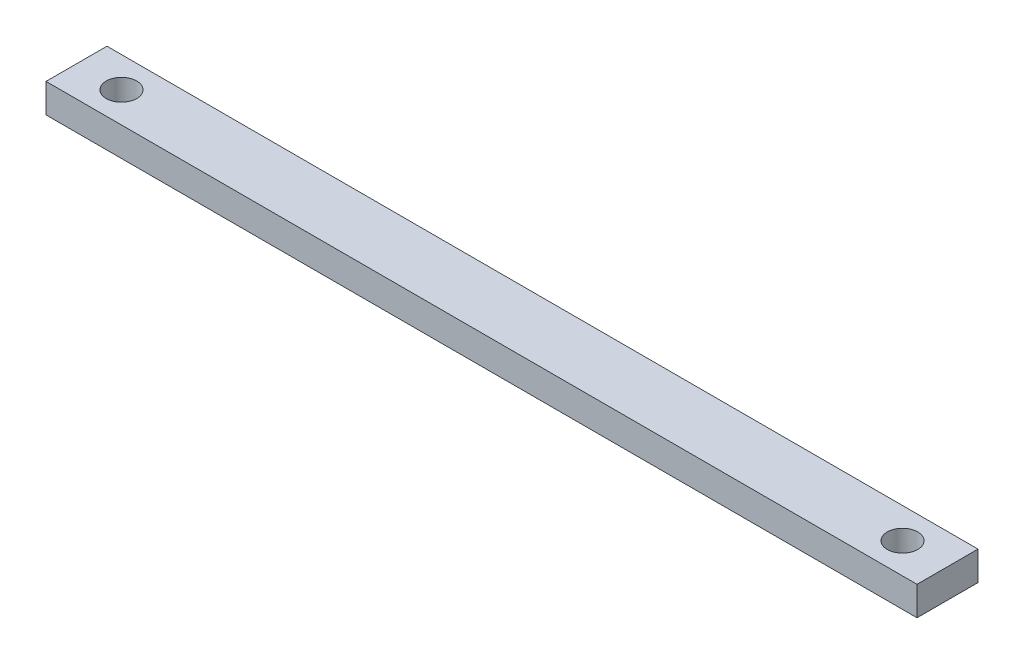
ISO-10303-21;
HEADER;
FILE_DESCRIPTION(('STEP AP214'),'2;1');
FILE_NAME('part.step','',(''),(''),'','','');
FILE_SCHEMA(('AUTOMOTIVE_DESIGN { 1 0 10303 214 1 1 1 1 }'));
ENDSEC;
DATA;
#1=APPLICATION_CONTEXT('core data for automotive mechanical design processes');
#2=APPLICATION_PROTOCOL_DEFINITION('international standard','automotive_design',2000,#1);
#3=PRODUCT_CONTEXT('',#1,'mechanical');
#4=PRODUCT('Part','Part','',(#3));
#5=PRODUCT_RELATED_PRODUCT_CATEGORY('part','',(#4));
#6=PRODUCT_DEFINITION_FORMATION('','',#4);
#7=PRODUCT_DEFINITION_CONTEXT('part definition',#1,'design');
#8=PRODUCT_DEFINITION('design','',#6,#7);
#9=PRODUCT_DEFINITION_SHAPE('','',#8);
#10=(LENGTH_UNIT() NAMED_UNIT(*) SI_UNIT(.MILLI.,.METRE.));
#11=(NAMED_UNIT(*) PLANE_ANGLE_UNIT() SI_UNIT($,.RADIAN.));
#12=(NAMED_UNIT(*) SI_UNIT($,.STERADIAN.) SOLID_ANGLE_UNIT());
#13=UNCERTAINTY_MEASURE_WITH_UNIT(LENGTH_MEASURE(1.E-05),#10,'distance_accuracy_value','');
#14=(GEOMETRIC_REPRESENTATION_CONTEXT(3) GLOBAL_UNCERTAINTY_ASSIGNED_CONTEXT((#13)) GLOBAL_UNIT_ASSIGNED_CONTEXT((#10,
#11,#12)) REPRESENTATION_CONTEXT('',''));
#15=CARTESIAN_POINT('',(0.,0.,0.));
#16=DIRECTION('',(0.,0.,1.));
#17=DIRECTION('',(1.,0.,0.));
#18=AXIS2_PLACEMENT_3D('',#15,#16,#17);
#19=CARTESIAN_POINT('',(300.,20.,21.));
#20=DIRECTION('',(-1.,0.,0.));
#21=DIRECTION('',(0.,0.,1.));
#22=AXIS2_PLACEMENT_3D('',#19,#20,#21);
#23=PLANE('',#22);
#24=DIRECTION('',(0.,0.,-1.));
#25=VECTOR('',#24,1.);
#26=CARTESIAN_POINT('',(300.,0.,21.));
#27=LINE('',#26,#25);
#28=CARTESIAN_POINT('',(300.,0.,21.));
#29=VERTEX_POINT('',#28);
#30=CARTESIAN_POINT('',(300.,0.,-21.));
#31=VERTEX_POINT('',#30);
#32=EDGE_CURVE('E100',#29,#31,#27,.T.);
#33=ORIENTED_EDGE('',*,*,#32,.T.);
#34=DIRECTION('',(0.,-1.,0.));
#35=VECTOR('',#34,1.);
#36=CARTESIAN_POINT('',(300.,20.,-21.));
#37=LINE('',#36,#35);
#38=CARTESIAN_POINT('',(300.,20.,-21.));
#39=VERTEX_POINT('',#38);
#40=EDGE_CURVE('E11',#39,#31,#37,.T.);
#41=ORIENTED_EDGE('',*,*,#40,.F.);
#42=DIRECTION('',(0.,0.,-1.));
#43=VECTOR('',#42,1.);
#44=CARTESIAN_POINT('',(300.,20.,21.));
#45=LINE('',#44,#43);
#46=CARTESIAN_POINT('',(300.,20.,21.));
#47=VERTEX_POINT('',#46);
#48=EDGE_CURVE('E88',#47,#39,#45,.T.);
#49=ORIENTED_EDGE('',*,*,#48,.F.);
#50=DIRECTION('',(0.,-1.,0.));
#51=VECTOR('',#50,1.);
#52=CARTESIAN_POINT('',(300.,20.,21.));
#53=LINE('',#52,#51);
#54=EDGE_CURVE('E96',#47,#29,#53,.T.);
#55=ORIENTED_EDGE('',*,*,#54,.T.);
#56=EDGE_LOOP('',(#33,#41,#49,#55));
#57=FACE_BOUND('',#56,.T.);
#58=ADVANCED_FACE('F37',(#57),#23,.F.);
#59=CARTESIAN_POINT('',(-300.,20.,-21.));
#60=DIRECTION('',(0.,0.,1.));
#61=DIRECTION('',(1.,0.,0.));
#62=AXIS2_PLACEMENT_3D('',#59,#60,#61);
#63=PLANE('',#62);
#64=DIRECTION('',(-1.,0.,0.));
#65=VECTOR('',#64,1.);
#66=CARTESIAN_POINT('',(-300.,0.,-21.));
#67=LINE('',#66,#65);
#68=CARTESIAN_POINT('',(-300.,0.,-21.));
#69=VERTEX_POINT('',#68);
#70=EDGE_CURVE('E92',#31,#69,#67,.T.);
#71=ORIENTED_EDGE('',*,*,#70,.T.);
#72=DIRECTION('',(0.,-1.,0.));
#73=VECTOR('',#72,1.);
#74=CARTESIAN_POINT('',(-300.,20.,-21.));
#75=LINE('',#74,#73);
#76=CARTESIAN_POINT('',(-300.,20.,-21.));
#77=VERTEX_POINT('',#76);
#78=EDGE_CURVE('E45',#77,#69,#75,.T.);
#79=ORIENTED_EDGE('',*,*,#78,.F.);
#80=DIRECTION('',(-1.,0.,0.));
#81=VECTOR('',#80,1.);
#82=CARTESIAN_POINT('',(-300.,20.,-21.));
#83=LINE('',#82,#81);
#84=EDGE_CURVE('E83',#39,#77,#83,.T.);
#85=ORIENTED_EDGE('',*,*,#84,.F.);
#86=ORIENTED_EDGE('',*,*,#40,.T.);
#87=EDGE_LOOP('',(#71,#79,#85,#86));
#88=FACE_BOUND('',#87,.T.);
#89=ADVANCED_FACE('F91',(#88),#63,.F.);
#90=CARTESIAN_POINT('',(-300.,20.,21.));
#91=DIRECTION('',(1.,0.,0.));
#92=DIRECTION('',(0.,0.,-1.));
#93=AXIS2_PLACEMENT_3D('',#90,#91,#92);
#94=PLANE('',#93);
#95=DIRECTION('',(0.,0.,1.));
#96=VECTOR('',#95,1.);
#97=CARTESIAN_POINT('',(-300.,0.,21.));
#98=LINE('',#97,#96);
#99=CARTESIAN_POINT('',(-300.,0.,21.));
#100=VERTEX_POINT('',#99);
#101=EDGE_CURVE('E70',#69,#100,#98,.T.);
#102=ORIENTED_EDGE('',*,*,#101,.T.);
#103=DIRECTION('',(0.,-1.,0.));
#104=VECTOR('',#103,1.);
#105=CARTESIAN_POINT('',(-300.,20.,21.));
#106=LINE('',#105,#104);
#107=CARTESIAN_POINT('',(-300.,20.,21.));
#108=VERTEX_POINT('',#107);
#109=EDGE_CURVE('E93',#108,#100,#106,.T.);
#110=ORIENTED_EDGE('',*,*,#109,.F.);
#111=DIRECTION('',(0.,0.,1.));
#112=VECTOR('',#111,1.);
#113=CARTESIAN_POINT('',(-300.,20.,21.));
#114=LINE('',#113,#112);
#115=EDGE_CURVE('E86',#77,#108,#114,.T.);
#116=ORIENTED_EDGE('',*,*,#115,.F.);
#117=ORIENTED_EDGE('',*,*,#78,.T.);
#118=EDGE_LOOP('',(#102,#110,#116,#117));
#119=FACE_BOUND('',#118,.T.);
#120=ADVANCED_FACE('F94',(#119),#94,.F.);
#121=CARTESIAN_POINT('',(-300.,20.,21.));
#122=DIRECTION('',(0.,0.,-1.));
#123=DIRECTION('',(-1.,0.,0.));
#124=AXIS2_PLACEMENT_3D('',#121,#122,#123);
#125=PLANE('',#124);
#126=DIRECTION('',(1.,0.,0.));
#127=VECTOR('',#126,1.);
#128=CARTESIAN_POINT('',(-300.,0.,21.));
#129=LINE('',#128,#127);
#130=EDGE_CURVE('E76',#100,#29,#129,.T.);
#131=ORIENTED_EDGE('',*,*,#130,.T.);
#132=ORIENTED_EDGE('',*,*,#54,.F.);
#133=DIRECTION('',(1.,0.,0.));
#134=VECTOR('',#133,1.);
#135=CARTESIAN_POINT('',(-300.,20.,21.));
#136=LINE('',#135,#134);
#137=EDGE_CURVE('E53',#108,#47,#136,.T.);
#138=ORIENTED_EDGE('',*,*,#137,.F.);
#139=ORIENTED_EDGE('',*,*,#109,.T.);
#140=EDGE_LOOP('',(#131,#132,#138,#139));
#141=FACE_BOUND('',#140,.T.);
#142=ADVANCED_FACE('F108',(#141),#125,.F.);
#143=CARTESIAN_POINT('',(0.,20.,0.));
#144=DIRECTION('',(0.,-1.,0.));
#145=DIRECTION('',(0.,0.,-1.));
#146=AXIS2_PLACEMENT_3D('',#143,#144,#145);
#147=PLANE('',#146);
#148=CARTESIAN_POINT('',(-269.,20.,0.));
#149=DIRECTION('',(0.,1.,0.));
#150=DIRECTION('',(0.,0.,1.));
#151=AXIS2_PLACEMENT_3D('',#148,#149,#150);
#152=CIRCLE('',#151,10.5);
#153=CARTESIAN_POINT('',(-269.,20.,10.5));
#154=VERTEX_POINT('',#153);
#155=EDGE_CURVE('E120',#154,#154,#152,.T.);
#156=ORIENTED_EDGE('',*,*,#155,.F.);
#157=EDGE_LOOP('',(#156));
#158=FACE_BOUND('',#157,.T.);
#159=CARTESIAN_POINT('',(269.,20.,0.));
#160=DIRECTION('',(0.,1.,0.));
#161=DIRECTION('',(0.,0.,1.));
#162=AXIS2_PLACEMENT_3D('',#159,#160,#161);
#163=CIRCLE('',#162,10.5);
#164=CARTESIAN_POINT('',(269.,20.,10.5));
#165=VERTEX_POINT('',#164);
#166=EDGE_CURVE('E117',#165,#165,#163,.T.);
#167=ORIENTED_EDGE('',*,*,#166,.F.);
#168=EDGE_LOOP('',(#167));
#169=FACE_BOUND('',#168,.T.);
#170=ORIENTED_EDGE('',*,*,#48,.T.);
#171=ORIENTED_EDGE('',*,*,#84,.T.);
#172=ORIENTED_EDGE('',*,*,#115,.T.);
#173=ORIENTED_EDGE('',*,*,#137,.T.);
#174=EDGE_LOOP('',(#170,#171,#172,#173));
#175=FACE_BOUND('',#174,.T.);
#176=ADVANCED_FACE('F84',(#158,#169,#175),#147,.F.);
#177=CARTESIAN_POINT('',(0.,0.,0.));
#178=DIRECTION('',(0.,-1.,0.));
#179=DIRECTION('',(0.,0.,-1.));
#180=AXIS2_PLACEMENT_3D('',#177,#178,#179);
#181=PLANE('',#180);
#182=CARTESIAN_POINT('',(-269.,0.,0.));
#183=DIRECTION('',(0.,1.,0.));
#184=DIRECTION('',(0.,0.,1.));
#185=AXIS2_PLACEMENT_3D('',#182,#183,#184);
#186=CIRCLE('',#185,10.5);
#187=CARTESIAN_POINT('',(-269.,0.,10.5));
#188=VERTEX_POINT('',#187);
#189=EDGE_CURVE('E103',#188,#188,#186,.T.);
#190=ORIENTED_EDGE('',*,*,#189,.T.);
#191=EDGE_LOOP('',(#190));
#192=FACE_BOUND('',#191,.T.);
#193=CARTESIAN_POINT('',(269.,0.,0.));
#194=DIRECTION('',(0.,1.,0.));
#195=DIRECTION('',(0.,0.,1.));
#196=AXIS2_PLACEMENT_3D('',#193,#194,#195);
#197=CIRCLE('',#196,10.5);
#198=CARTESIAN_POINT('',(269.,0.,10.5));
#199=VERTEX_POINT('',#198);
#200=EDGE_CURVE('E114',#199,#199,#197,.T.);
#201=ORIENTED_EDGE('',*,*,#200,.T.);
#202=EDGE_LOOP('',(#201));
#203=FACE_BOUND('',#202,.T.);
#204=ORIENTED_EDGE('',*,*,#32,.F.);
#205=ORIENTED_EDGE('',*,*,#130,.F.);
#206=ORIENTED_EDGE('',*,*,#101,.F.);
#207=ORIENTED_EDGE('',*,*,#70,.F.);
#208=EDGE_LOOP('',(#204,#205,#206,#207));
#209=FACE_BOUND('',#208,.T.);
#210=ADVANCED_FACE('F111',(#192,#203,#209),#181,.T.);
#211=CARTESIAN_POINT('',(269.,0.,0.));
#212=DIRECTION('',(0.,1.,0.));
#213=DIRECTION('',(0.,0.,1.));
#214=AXIS2_PLACEMENT_3D('',#211,#212,#213);
#215=CYLINDRICAL_SURFACE('',#214,10.5);
#216=ORIENTED_EDGE('',*,*,#200,.F.);
#217=EDGE_LOOP('',(#216));
#218=FACE_BOUND('',#217,.T.);
#219=ORIENTED_EDGE('',*,*,#166,.T.);
#220=EDGE_LOOP('',(#219));
#221=FACE_BOUND('',#220,.T.);
#222=ADVANCED_FACE('F131',(#218,#221),#215,.F.);
#223=CARTESIAN_POINT('',(-269.,0.,0.));
#224=DIRECTION('',(0.,1.,0.));
#225=DIRECTION('',(0.,0.,1.));
#226=AXIS2_PLACEMENT_3D('',#223,#224,#225);
#227=CYLINDRICAL_SURFACE('',#226,10.5);
#228=ORIENTED_EDGE('',*,*,#189,.F.);
#229=EDGE_LOOP('',(#228));
#230=FACE_BOUND('',#229,.T.);
#231=ORIENTED_EDGE('',*,*,#155,.T.);
#232=EDGE_LOOP('',(#231));
#233=FACE_BOUND('',#232,.T.);
#234=ADVANCED_FACE('F128',(#230,#233),#227,.F.);
#235=CLOSED_SHELL('',(#58,#89,#120,#142,#176,#210,#222,#234));
#236=MANIFOLD_SOLID_BREP('B2',#235);
#237=ADVANCED_BREP_SHAPE_REPRESENTATION('',(#18,#236),#14);
#238=SHAPE_DEFINITION_REPRESENTATION(#9,#237);
ENDSEC;
END-ISO-10303-21;
